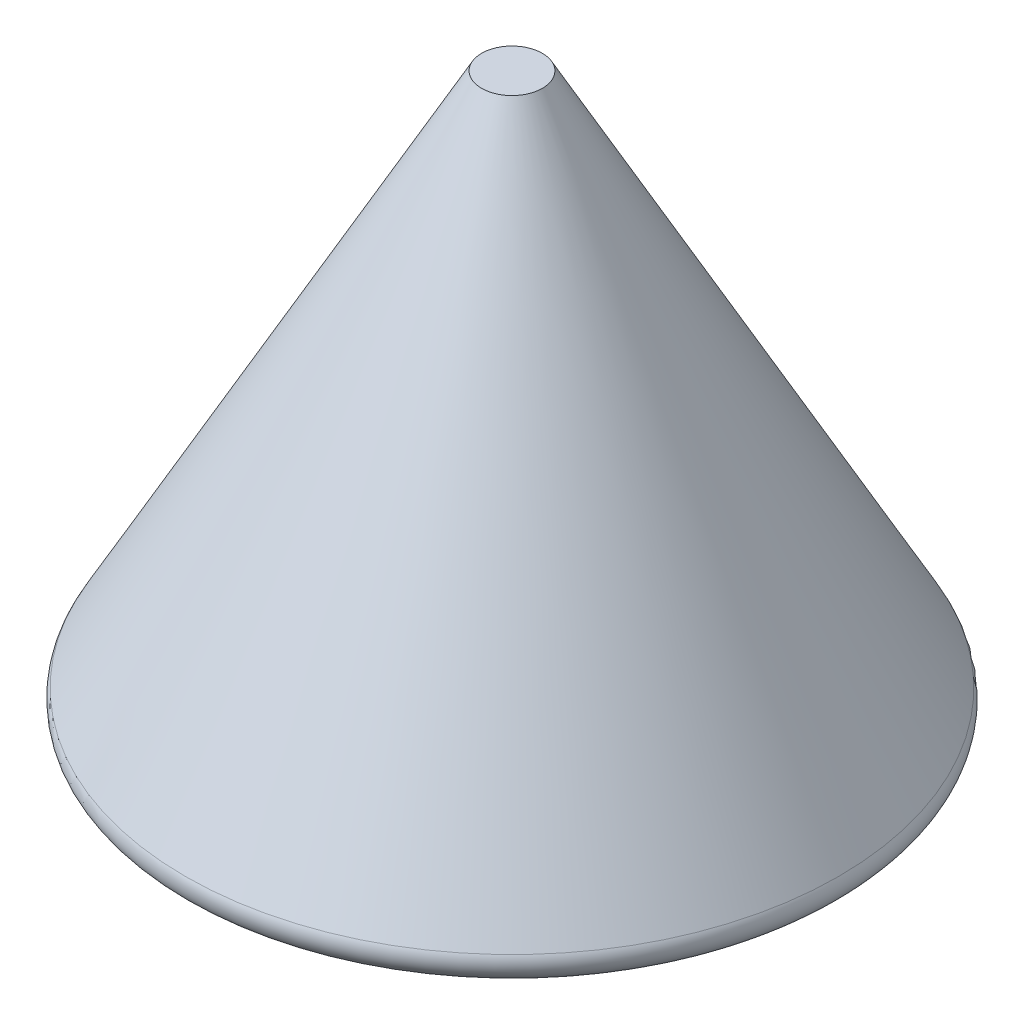
ISO-10303-21;
HEADER;
FILE_DESCRIPTION(('STEP AP214'),'2;1');
FILE_NAME('part.step','',(''),(''),'','','');
FILE_SCHEMA(('AUTOMOTIVE_DESIGN { 1 0 10303 214 1 1 1 1 }'));
ENDSEC;
DATA;
#1=APPLICATION_CONTEXT('core data for automotive mechanical design processes');
#2=APPLICATION_PROTOCOL_DEFINITION('international standard','automotive_design',2000,#1);
#3=PRODUCT_CONTEXT('',#1,'mechanical');
#4=PRODUCT('Part','Part','',(#3));
#5=PRODUCT_RELATED_PRODUCT_CATEGORY('part','',(#4));
#6=PRODUCT_DEFINITION_FORMATION('','',#4);
#7=PRODUCT_DEFINITION_CONTEXT('part definition',#1,'design');
#8=PRODUCT_DEFINITION('design','',#6,#7);
#9=PRODUCT_DEFINITION_SHAPE('','',#8);
#10=(LENGTH_UNIT() NAMED_UNIT(*) SI_UNIT(.MILLI.,.METRE.));
#11=(NAMED_UNIT(*) PLANE_ANGLE_UNIT() SI_UNIT($,.RADIAN.));
#12=(NAMED_UNIT(*) SI_UNIT($,.STERADIAN.) SOLID_ANGLE_UNIT());
#13=UNCERTAINTY_MEASURE_WITH_UNIT(LENGTH_MEASURE(1.E-05),#10,'distance_accuracy_value','');
#14=(GEOMETRIC_REPRESENTATION_CONTEXT(3) GLOBAL_UNCERTAINTY_ASSIGNED_CONTEXT((#13)) GLOBAL_UNIT_ASSIGNED_CONTEXT((#10,
#11,#12)) REPRESENTATION_CONTEXT('',''));
#15=CARTESIAN_POINT('',(0.,0.,0.));
#16=DIRECTION('',(0.,0.,1.));
#17=DIRECTION('',(1.,0.,0.));
#18=AXIS2_PLACEMENT_3D('',#15,#16,#17);
#19=CARTESIAN_POINT('',(0.,0.,0.));
#20=DIRECTION('',(0.,-1.,0.));
#21=DIRECTION('',(0.,0.,1.));
#22=AXIS2_PLACEMENT_3D('',#19,#20,#21);
#23=CONICAL_SURFACE('',#22,36.5,0.506145483078356);
#24=CARTESIAN_POINT('',(0.,2.96961924049267,0.));
#25=DIRECTION('',(0.,1.,0.));
#26=DIRECTION('',(0.,0.,1.));
#27=AXIS2_PLACEMENT_3D('',#24,#25,#26);
#28=CIRCLE('',#27,34.8539131756266);
#29=CARTESIAN_POINT('',(0.,2.96961924049267,34.8539131756266));
#30=VERTEX_POINT('',#29);
#31=EDGE_CURVE('E40',#30,#30,#28,.T.);
#32=CARTESIAN_POINT('',(0.,60.,0.));
#33=DIRECTION('',(0.,1.,0.));
#34=DIRECTION('',(0.,0.,1.));
#35=AXIS2_PLACEMENT_3D('',#32,#33,#34);
#36=CIRCLE('',#35,3.24145691283384);
#37=CARTESIAN_POINT('',(0.,60.,3.24145691283385));
#38=VERTEX_POINT('',#37);
#39=EDGE_CURVE('E44',#38,#38,#36,.T.);
#40=CARTESIAN_POINT('',(0.,2.96961924049267,34.8539131756266));
#41=CARTESIAN_POINT('',(0.,3.56368570673754,34.5246167562225));
#42=CARTESIAN_POINT('',(0.,4.15775217298241,34.1953203368184));
#43=CARTESIAN_POINT('',(0.,5.34588510547215,33.5367274980102));
#44=CARTESIAN_POINT('',(0.,5.93995157171701,33.2074310786061));
#45=CARTESIAN_POINT('',(0.,7.12808450420675,32.548838239798));
#46=CARTESIAN_POINT('',(0.,7.72215097045162,32.2195418203939));
#47=CARTESIAN_POINT('',(0.,8.91028390294135,31.5609489815857));
#48=CARTESIAN_POINT('',(0.,9.50435036918622,31.2316525621816));
#49=CARTESIAN_POINT('',(0.,10.692483301676,30.5730597233734));
#50=CARTESIAN_POINT('',(0.,11.2865497679208,30.2437633039693));
#51=CARTESIAN_POINT('',(0.,12.4746827004106,29.5851704651611));
#52=CARTESIAN_POINT('',(0.,13.0687491666554,29.2558740457571));
#53=CARTESIAN_POINT('',(0.,14.2568820991452,28.5972812069489));
#54=CARTESIAN_POINT('',(0.,14.85094856539,28.2679847875448));
#55=CARTESIAN_POINT('',(0.,16.0390814978798,27.6093919487366));
#56=CARTESIAN_POINT('',(0.,16.6331479641246,27.2800955293325));
#57=CARTESIAN_POINT('',(0.,17.8212808966144,26.6215026905243));
#58=CARTESIAN_POINT('',(0.,18.4153473628592,26.2922062711202));
#59=CARTESIAN_POINT('',(0.,19.603480295349,25.6336134323121));
#60=CARTESIAN_POINT('',(0.,20.1975467615938,25.304317012908));
#61=CARTESIAN_POINT('',(0.,21.3856796940836,24.6457241740998));
#62=CARTESIAN_POINT('',(0.,21.9797461603284,24.3164277546957));
#63=CARTESIAN_POINT('',(0.,23.1678790928182,23.6578349158875));
#64=CARTESIAN_POINT('',(0.,23.7619455590631,23.3285384964834));
#65=CARTESIAN_POINT('',(0.,24.9500784915528,22.6699456576752));
#66=CARTESIAN_POINT('',(0.,25.5441449577977,22.3406492382711));
#67=CARTESIAN_POINT('',(0.,26.7322778902874,21.682056399463));
#68=CARTESIAN_POINT('',(0.,27.3263443565323,21.3527599800589));
#69=CARTESIAN_POINT('',(0.,28.514477289022,20.6941671412507));
#70=CARTESIAN_POINT('',(0.,29.1085437552669,20.3648707218466));
#71=CARTESIAN_POINT('',(0.,30.2966766877566,19.7062778830384));
#72=CARTESIAN_POINT('',(0.,30.8907431540015,19.3769814636343));
#73=CARTESIAN_POINT('',(0.,32.0788760864912,18.7183886248261));
#74=CARTESIAN_POINT('',(0.,32.6729425527361,18.389092205422));
#75=CARTESIAN_POINT('',(0.,33.8610754852258,17.7304993666139));
#76=CARTESIAN_POINT('',(0.,34.4551419514707,17.4012029472098));
#77=CARTESIAN_POINT('',(0.,35.6432748839604,16.7426101084016));
#78=CARTESIAN_POINT('',(0.,36.2373413502053,16.4133136889975));
#79=CARTESIAN_POINT('',(0.,37.425474282695,15.7547208501893));
#80=CARTESIAN_POINT('',(0.,38.0195407489399,15.4254244307852));
#81=CARTESIAN_POINT('',(0.,39.2076736814296,14.766831591977));
#82=CARTESIAN_POINT('',(0.,39.8017401476745,14.437535172573));
#83=CARTESIAN_POINT('',(0.,40.9898730801642,13.7789423337648));
#84=CARTESIAN_POINT('',(0.,41.5839395464091,13.4496459143607));
#85=CARTESIAN_POINT('',(0.,42.7720724788988,12.7910530755525));
#86=CARTESIAN_POINT('',(0.,43.3661389451437,12.4617566561484));
#87=CARTESIAN_POINT('',(0.,44.5542718776334,11.8031638173402));
#88=CARTESIAN_POINT('',(0.,45.1483383438783,11.4738673979361));
#89=CARTESIAN_POINT('',(0.,46.336471276368,10.8152745591279));
#90=CARTESIAN_POINT('',(0.,46.9305377426129,10.4859781397239));
#91=CARTESIAN_POINT('',(0.,48.1186706751026,9.82738530091567));
#92=CARTESIAN_POINT('',(0.,48.7127371413475,9.49808888151158));
#93=CARTESIAN_POINT('',(0.,49.9008700738372,8.8394960427034));
#94=CARTESIAN_POINT('',(0.,50.4949365400821,8.5101996232993));
#95=CARTESIAN_POINT('',(0.,51.6830694725718,7.85160678449112));
#96=CARTESIAN_POINT('',(0.,52.2771359388167,7.52231036508703));
#97=CARTESIAN_POINT('',(0.,53.4652688713064,6.86371752627885));
#98=CARTESIAN_POINT('',(0.,54.0593353375513,6.53442110687476));
#99=CARTESIAN_POINT('',(0.,55.2474682700411,5.87582826806657));
#100=CARTESIAN_POINT('',(0.,55.8415347362859,5.54653184866248));
#101=CARTESIAN_POINT('',(0.,57.0296676687757,4.8879390098543));
#102=CARTESIAN_POINT('',(0.,57.6237341350205,4.55864259045021));
#103=CARTESIAN_POINT('',(0.,58.8118670675103,3.90004975164203));
#104=CARTESIAN_POINT('',(0.,59.4059335337551,3.57075333223794));
#105=CARTESIAN_POINT('',(0.,60.,3.24145691283385));
#106=B_SPLINE_CURVE_WITH_KNOTS('',3,(#40,#41,#42,#43,#44,#45,#46,#47,#48,#49,#50,#51,#52,#53,
#54,#55,#56,#57,#58,#59,#60,#61,#62,#63,#64,#65,#66,#67,#68,#69,#70,#71,#72,#73,#74,#75,#76,#77,
#78,#79,#80,#81,#82,#83,#84,#85,#86,#87,#88,#89,#90,#91,#92,#93,#94,#95,#96,#97,#98,#99,#100,
#101,#102,#103,#104,#105),.UNSPECIFIED.,.F.,.F.,(4,2,2,2,2,2,2,2,2,2,2,2,2,2,2,2,2,2,2,2,2,2,2,
2,2,2,2,2,2,2,2,2,4),(0.,2.0376849323046,4.07536986460919,6.11305479691378,8.15073972921838,
10.188424661523,12.2261095938276,14.2637945261322,16.3014794584368,18.3391643907413,
20.3768493230459,22.4145342553505,24.4522191876551,26.4899041199597,28.5275890522643,
30.5652739845689,32.6029589168735,34.6406438491781,36.6783287814827,38.7160137137873,
40.7536986460919,42.7913835783965,44.8290685107011,46.8667534430057,48.9044383753103,
50.9421233076149,52.9798082399195,55.0174931722241,57.0551781045287,59.0928630368333,
61.1305479691379,63.1682329014425,65.2059178337471),.UNSPECIFIED.);
#107=EDGE_CURVE('BSEAM33',#30,#38,#106,.T.);
#108=ORIENTED_EDGE('',*,*,#31,.T.);
#109=ORIENTED_EDGE('',*,*,#39,.F.);
#110=ORIENTED_EDGE('',*,*,#107,.T.);
#111=ORIENTED_EDGE('',*,*,#107,.F.);
#112=EDGE_LOOP('',(#108,#110,#109,#111));
#113=FACE_BOUND('',#112,.T.);
#114=ADVANCED_FACE('F33',(#113),#23,.T.);
#115=CARTESIAN_POINT('',(0.,60.,0.));
#116=DIRECTION('',(0.,1.,0.));
#117=DIRECTION('',(0.,0.,1.));
#118=AXIS2_PLACEMENT_3D('',#115,#116,#117);
#119=PLANE('',#118);
#120=ORIENTED_EDGE('',*,*,#39,.T.);
#121=EDGE_LOOP('',(#120));
#122=FACE_BOUND('',#121,.T.);
#123=ADVANCED_FACE('F51',(#122),#119,.T.);
#124=CARTESIAN_POINT('',(0.,0.,0.));
#125=DIRECTION('',(0.,1.,0.));
#126=DIRECTION('',(0.,0.,1.));
#127=AXIS2_PLACEMENT_3D('',#124,#125,#126);
#128=PLANE('',#127);
#129=CARTESIAN_POINT('',(0.,0.,0.));
#130=DIRECTION('',(0.,1.,0.));
#131=DIRECTION('',(0.,0.,1.));
#132=AXIS2_PLACEMENT_3D('',#129,#130,#131);
#133=CIRCLE('',#132,33.1046737613478);
#134=CARTESIAN_POINT('',(0.,0.,33.1046737613478));
#135=VERTEX_POINT('',#134);
#136=EDGE_CURVE('E10',#135,#135,#133,.F.);
#137=ORIENTED_EDGE('',*,*,#136,.T.);
#138=EDGE_LOOP('',(#137));
#139=FACE_BOUND('',#138,.T.);
#140=ADVANCED_FACE('F57',(#139),#128,.F.);
#141=CARTESIAN_POINT('',(0.,2.,0.));
#142=DIRECTION('',(0.,1.,0.));
#143=DIRECTION('',(0.,0.,1.));
#144=AXIS2_PLACEMENT_3D('',#141,#142,#143);
#145=TOROIDAL_SURFACE('',#144,33.1046737613478,2.);
#146=ORIENTED_EDGE('',*,*,#136,.F.);
#147=EDGE_LOOP('',(#146));
#148=FACE_BOUND('',#147,.T.);
#149=ORIENTED_EDGE('',*,*,#31,.F.);
#150=EDGE_LOOP('',(#149));
#151=FACE_BOUND('',#150,.T.);
#152=ADVANCED_FACE('F35',(#148,#151),#145,.T.);
#153=CLOSED_SHELL('',(#114,#123,#140,#152));
#154=MANIFOLD_SOLID_BREP('B2',#153);
#155=ADVANCED_BREP_SHAPE_REPRESENTATION('',(#18,#154),#14);
#156=SHAPE_DEFINITION_REPRESENTATION(#9,#155);
ENDSEC;
END-ISO-10303-21;
